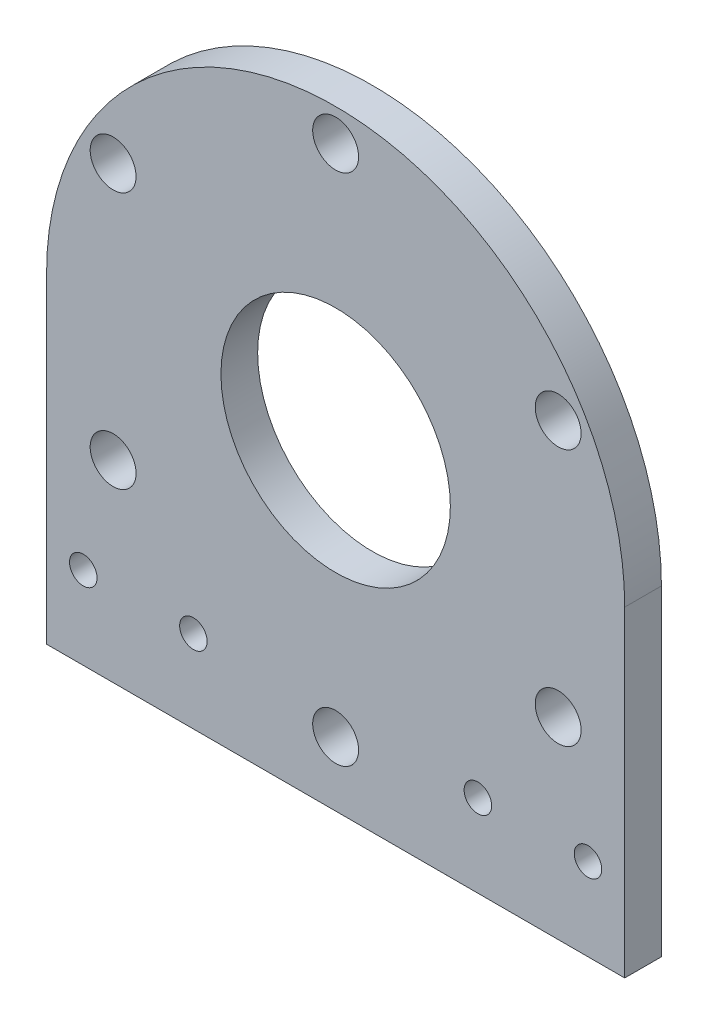
ISO-10303-21;
HEADER;
FILE_DESCRIPTION(('STEP AP214'),'2;1');
FILE_NAME('part.step','',(''),(''),'','','');
FILE_SCHEMA(('AUTOMOTIVE_DESIGN { 1 0 10303 214 1 1 1 1 }'));
ENDSEC;
DATA;
#1=APPLICATION_CONTEXT('core data for automotive mechanical design processes');
#2=APPLICATION_PROTOCOL_DEFINITION('international standard','automotive_design',2000,#1);
#3=PRODUCT_CONTEXT('',#1,'mechanical');
#4=PRODUCT('Part','Part','',(#3));
#5=PRODUCT_RELATED_PRODUCT_CATEGORY('part','',(#4));
#6=PRODUCT_DEFINITION_FORMATION('','',#4);
#7=PRODUCT_DEFINITION_CONTEXT('part definition',#1,'design');
#8=PRODUCT_DEFINITION('design','',#6,#7);
#9=PRODUCT_DEFINITION_SHAPE('','',#8);
#10=(LENGTH_UNIT() NAMED_UNIT(*) SI_UNIT(.MILLI.,.METRE.));
#11=(NAMED_UNIT(*) PLANE_ANGLE_UNIT() SI_UNIT($,.RADIAN.));
#12=(NAMED_UNIT(*) SI_UNIT($,.STERADIAN.) SOLID_ANGLE_UNIT());
#13=UNCERTAINTY_MEASURE_WITH_UNIT(LENGTH_MEASURE(1.E-05),#10,'distance_accuracy_value','');
#14=(GEOMETRIC_REPRESENTATION_CONTEXT(3) GLOBAL_UNCERTAINTY_ASSIGNED_CONTEXT((#13)) GLOBAL_UNIT_ASSIGNED_CONTEXT((#10,
#11,#12)) REPRESENTATION_CONTEXT('',''));
#15=CARTESIAN_POINT('',(0.,0.,0.));
#16=DIRECTION('',(0.,0.,1.));
#17=DIRECTION('',(1.,0.,0.));
#18=AXIS2_PLACEMENT_3D('',#15,#16,#17);
#19=CARTESIAN_POINT('',(0.,0.,4.));
#20=DIRECTION('',(0.,0.,-1.));
#21=DIRECTION('',(-1.,0.,0.));
#22=AXIS2_PLACEMENT_3D('',#19,#20,#21);
#23=CYLINDRICAL_SURFACE('',#22,31.5);
#24=CARTESIAN_POINT('',(0.,0.,0.));
#25=DIRECTION('',(0.,0.,1.));
#26=DIRECTION('',(1.,0.,0.));
#27=AXIS2_PLACEMENT_3D('',#24,#25,#26);
#28=CIRCLE('',#27,31.5);
#29=CARTESIAN_POINT('',(31.5,0.,0.));
#30=VERTEX_POINT('',#29);
#31=CARTESIAN_POINT('',(-31.5,0.,0.));
#32=VERTEX_POINT('',#31);
#33=EDGE_CURVE('E109',#30,#32,#28,.T.);
#34=ORIENTED_EDGE('',*,*,#33,.T.);
#35=DIRECTION('',(0.,0.,-1.));
#36=VECTOR('',#35,1.);
#37=CARTESIAN_POINT('',(-31.5,0.,4.));
#38=LINE('',#37,#36);
#39=CARTESIAN_POINT('',(-31.5,0.,4.));
#40=VERTEX_POINT('',#39);
#41=EDGE_CURVE('E11',#40,#32,#38,.T.);
#42=ORIENTED_EDGE('',*,*,#41,.F.);
#43=CARTESIAN_POINT('',(0.,0.,4.));
#44=DIRECTION('',(0.,0.,1.));
#45=DIRECTION('',(1.,0.,0.));
#46=AXIS2_PLACEMENT_3D('',#43,#44,#45);
#47=CIRCLE('',#46,31.5);
#48=CARTESIAN_POINT('',(31.5,0.,4.));
#49=VERTEX_POINT('',#48);
#50=EDGE_CURVE('E93',#49,#40,#47,.T.);
#51=ORIENTED_EDGE('',*,*,#50,.F.);
#52=DIRECTION('',(0.,0.,-1.));
#53=VECTOR('',#52,1.);
#54=CARTESIAN_POINT('',(31.5,0.,4.));
#55=LINE('',#54,#53);
#56=EDGE_CURVE('E105',#49,#30,#55,.T.);
#57=ORIENTED_EDGE('',*,*,#56,.T.);
#58=EDGE_LOOP('',(#34,#42,#51,#57));
#59=FACE_BOUND('',#58,.T.);
#60=ADVANCED_FACE('F41',(#59),#23,.T.);
#61=CARTESIAN_POINT('',(-31.5,0.,4.));
#62=DIRECTION('',(1.,0.,0.));
#63=DIRECTION('',(0.,1.,0.));
#64=AXIS2_PLACEMENT_3D('',#61,#62,#63);
#65=PLANE('',#64);
#66=DIRECTION('',(0.,-1.,0.));
#67=VECTOR('',#66,1.);
#68=CARTESIAN_POINT('',(-31.5,0.,0.));
#69=LINE('',#68,#67);
#70=CARTESIAN_POINT('',(-31.5,-35.,0.));
#71=VERTEX_POINT('',#70);
#72=EDGE_CURVE('E98',#32,#71,#69,.T.);
#73=ORIENTED_EDGE('',*,*,#72,.T.);
#74=DIRECTION('',(0.,0.,-1.));
#75=VECTOR('',#74,1.);
#76=CARTESIAN_POINT('',(-31.5,-35.,4.));
#77=LINE('',#76,#75);
#78=CARTESIAN_POINT('',(-31.5,-35.,4.));
#79=VERTEX_POINT('',#78);
#80=EDGE_CURVE('E50',#79,#71,#77,.T.);
#81=ORIENTED_EDGE('',*,*,#80,.F.);
#82=DIRECTION('',(0.,-1.,0.));
#83=VECTOR('',#82,1.);
#84=CARTESIAN_POINT('',(-31.5,0.,4.));
#85=LINE('',#84,#83);
#86=EDGE_CURVE('E88',#40,#79,#85,.T.);
#87=ORIENTED_EDGE('',*,*,#86,.F.);
#88=ORIENTED_EDGE('',*,*,#41,.T.);
#89=EDGE_LOOP('',(#73,#81,#87,#88));
#90=FACE_BOUND('',#89,.T.);
#91=ADVANCED_FACE('F97',(#90),#65,.F.);
#92=CARTESIAN_POINT('',(0.,-35.,4.));
#93=DIRECTION('',(0.,1.,0.));
#94=DIRECTION('',(0.,0.,1.));
#95=AXIS2_PLACEMENT_3D('',#92,#93,#94);
#96=PLANE('',#95);
#97=DIRECTION('',(1.,0.,0.));
#98=VECTOR('',#97,1.);
#99=CARTESIAN_POINT('',(0.,-35.,0.));
#100=LINE('',#99,#98);
#101=CARTESIAN_POINT('',(31.5,-35.,0.));
#102=VERTEX_POINT('',#101);
#103=EDGE_CURVE('E75',#71,#102,#100,.T.);
#104=ORIENTED_EDGE('',*,*,#103,.T.);
#105=DIRECTION('',(0.,0.,-1.));
#106=VECTOR('',#105,1.);
#107=CARTESIAN_POINT('',(31.5,-35.,4.));
#108=LINE('',#107,#106);
#109=CARTESIAN_POINT('',(31.5,-35.,4.));
#110=VERTEX_POINT('',#109);
#111=EDGE_CURVE('E100',#110,#102,#108,.T.);
#112=ORIENTED_EDGE('',*,*,#111,.F.);
#113=DIRECTION('',(1.,0.,0.));
#114=VECTOR('',#113,1.);
#115=CARTESIAN_POINT('',(0.,-35.,4.));
#116=LINE('',#115,#114);
#117=EDGE_CURVE('E91',#79,#110,#116,.T.);
#118=ORIENTED_EDGE('',*,*,#117,.F.);
#119=ORIENTED_EDGE('',*,*,#80,.T.);
#120=EDGE_LOOP('',(#104,#112,#118,#119));
#121=FACE_BOUND('',#120,.T.);
#122=ADVANCED_FACE('F101',(#121),#96,.F.);
#123=CARTESIAN_POINT('',(31.5,0.,4.));
#124=DIRECTION('',(-1.,0.,0.));
#125=DIRECTION('',(0.,-1.,0.));
#126=AXIS2_PLACEMENT_3D('',#123,#124,#125);
#127=PLANE('',#126);
#128=DIRECTION('',(0.,1.,0.));
#129=VECTOR('',#128,1.);
#130=CARTESIAN_POINT('',(31.5,0.,0.));
#131=LINE('',#130,#129);
#132=EDGE_CURVE('E81',#102,#30,#131,.T.);
#133=ORIENTED_EDGE('',*,*,#132,.T.);
#134=ORIENTED_EDGE('',*,*,#56,.F.);
#135=DIRECTION('',(0.,1.,0.));
#136=VECTOR('',#135,1.);
#137=CARTESIAN_POINT('',(31.5,0.,4.));
#138=LINE('',#137,#136);
#139=EDGE_CURVE('E58',#110,#49,#138,.T.);
#140=ORIENTED_EDGE('',*,*,#139,.F.);
#141=ORIENTED_EDGE('',*,*,#111,.T.);
#142=EDGE_LOOP('',(#133,#134,#140,#141));
#143=FACE_BOUND('',#142,.T.);
#144=ADVANCED_FACE('F123',(#143),#127,.F.);
#145=CARTESIAN_POINT('',(0.,0.,4.));
#146=DIRECTION('',(0.,0.,1.));
#147=DIRECTION('',(1.,0.,0.));
#148=AXIS2_PLACEMENT_3D('',#145,#146,#147);
#149=PLANE('',#148);
#150=CARTESIAN_POINT('',(-27.5,-26.,4.));
#151=DIRECTION('',(0.,0.,1.));
#152=DIRECTION('',(1.,0.,0.));
#153=AXIS2_PLACEMENT_3D('',#150,#151,#152);
#154=CIRCLE('',#153,1.5);
#155=CARTESIAN_POINT('',(-26.,-26.,4.));
#156=VERTEX_POINT('',#155);
#157=EDGE_CURVE('E210',#156,#156,#154,.T.);
#158=ORIENTED_EDGE('',*,*,#157,.F.);
#159=EDGE_LOOP('',(#158));
#160=FACE_BOUND('',#159,.T.);
#161=CARTESIAN_POINT('',(-15.5,-26.,4.));
#162=DIRECTION('',(0.,0.,1.));
#163=DIRECTION('',(1.,0.,0.));
#164=AXIS2_PLACEMENT_3D('',#161,#162,#163);
#165=CIRCLE('',#164,1.5);
#166=CARTESIAN_POINT('',(-14.,-26.,4.));
#167=VERTEX_POINT('',#166);
#168=EDGE_CURVE('E202',#167,#167,#165,.T.);
#169=ORIENTED_EDGE('',*,*,#168,.F.);
#170=EDGE_LOOP('',(#169));
#171=FACE_BOUND('',#170,.T.);
#172=CARTESIAN_POINT('',(15.5,-26.,4.));
#173=DIRECTION('',(0.,0.,1.));
#174=DIRECTION('',(-1.,0.,0.));
#175=AXIS2_PLACEMENT_3D('',#172,#173,#174);
#176=CIRCLE('',#175,1.5);
#177=CARTESIAN_POINT('',(14.,-26.,4.));
#178=VERTEX_POINT('',#177);
#179=EDGE_CURVE('E194',#178,#178,#176,.T.);
#180=ORIENTED_EDGE('',*,*,#179,.F.);
#181=EDGE_LOOP('',(#180));
#182=FACE_BOUND('',#181,.T.);
#183=CARTESIAN_POINT('',(27.5,-26.,4.));
#184=DIRECTION('',(0.,0.,1.));
#185=DIRECTION('',(-1.,0.,0.));
#186=AXIS2_PLACEMENT_3D('',#183,#184,#185);
#187=CIRCLE('',#186,1.5);
#188=CARTESIAN_POINT('',(26.,-26.,4.));
#189=VERTEX_POINT('',#188);
#190=EDGE_CURVE('E186',#189,#189,#187,.T.);
#191=ORIENTED_EDGE('',*,*,#190,.F.);
#192=EDGE_LOOP('',(#191));
#193=FACE_BOUND('',#192,.T.);
#194=CARTESIAN_POINT('',(-24.2487113059643,-14.,4.));
#195=DIRECTION('',(0.,0.,1.));
#196=DIRECTION('',(1.,0.,0.));
#197=AXIS2_PLACEMENT_3D('',#194,#195,#196);
#198=CIRCLE('',#197,2.5);
#199=CARTESIAN_POINT('',(-21.7487113059643,-14.,4.));
#200=VERTEX_POINT('',#199);
#201=EDGE_CURVE('E154',#200,#200,#198,.T.);
#202=ORIENTED_EDGE('',*,*,#201,.F.);
#203=EDGE_LOOP('',(#202));
#204=FACE_BOUND('',#203,.T.);
#205=CARTESIAN_POINT('',(24.2487113059643,-14.,4.));
#206=DIRECTION('',(0.,0.,1.));
#207=DIRECTION('',(1.,0.,0.));
#208=AXIS2_PLACEMENT_3D('',#205,#206,#207);
#209=CIRCLE('',#208,2.5);
#210=CARTESIAN_POINT('',(26.7487113059643,-14.,4.));
#211=VERTEX_POINT('',#210);
#212=EDGE_CURVE('E163',#211,#211,#209,.T.);
#213=ORIENTED_EDGE('',*,*,#212,.F.);
#214=EDGE_LOOP('',(#213));
#215=FACE_BOUND('',#214,.T.);
#216=CARTESIAN_POINT('',(0.,-28.,4.));
#217=DIRECTION('',(0.,0.,1.));
#218=DIRECTION('',(1.,0.,0.));
#219=AXIS2_PLACEMENT_3D('',#216,#217,#218);
#220=CIRCLE('',#219,2.5);
#221=CARTESIAN_POINT('',(2.5,-28.,4.));
#222=VERTEX_POINT('',#221);
#223=EDGE_CURVE('E138',#222,#222,#220,.T.);
#224=ORIENTED_EDGE('',*,*,#223,.F.);
#225=EDGE_LOOP('',(#224));
#226=FACE_BOUND('',#225,.T.);
#227=CARTESIAN_POINT('',(0.,28.,4.));
#228=DIRECTION('',(0.,0.,1.));
#229=DIRECTION('',(1.,0.,0.));
#230=AXIS2_PLACEMENT_3D('',#227,#228,#229);
#231=CIRCLE('',#230,2.5);
#232=CARTESIAN_POINT('',(2.5,28.,4.));
#233=VERTEX_POINT('',#232);
#234=EDGE_CURVE('E147',#233,#233,#231,.T.);
#235=ORIENTED_EDGE('',*,*,#234,.F.);
#236=EDGE_LOOP('',(#235));
#237=FACE_BOUND('',#236,.T.);
#238=CARTESIAN_POINT('',(-24.2487113059643,14.,4.));
#239=DIRECTION('',(0.,0.,1.));
#240=DIRECTION('',(1.,0.,0.));
#241=AXIS2_PLACEMENT_3D('',#238,#239,#240);
#242=CIRCLE('',#241,2.5);
#243=CARTESIAN_POINT('',(-21.7487113059643,14.,4.));
#244=VERTEX_POINT('',#243);
#245=EDGE_CURVE('E179',#244,#244,#242,.T.);
#246=ORIENTED_EDGE('',*,*,#245,.F.);
#247=EDGE_LOOP('',(#246));
#248=FACE_BOUND('',#247,.T.);
#249=CARTESIAN_POINT('',(24.2487113059643,14.,4.));
#250=DIRECTION('',(0.,0.,1.));
#251=DIRECTION('',(1.,0.,0.));
#252=AXIS2_PLACEMENT_3D('',#249,#250,#251);
#253=CIRCLE('',#252,2.5);
#254=CARTESIAN_POINT('',(26.7487113059643,14.,4.));
#255=VERTEX_POINT('',#254);
#256=EDGE_CURVE('E170',#255,#255,#253,.T.);
#257=ORIENTED_EDGE('',*,*,#256,.F.);
#258=EDGE_LOOP('',(#257));
#259=FACE_BOUND('',#258,.T.);
#260=CARTESIAN_POINT('',(0.,0.,4.));
#261=DIRECTION('',(0.,0.,1.));
#262=DIRECTION('',(1.,0.,0.));
#263=AXIS2_PLACEMENT_3D('',#260,#261,#262);
#264=CIRCLE('',#263,12.5);
#265=CARTESIAN_POINT('',(12.5,0.,4.));
#266=VERTEX_POINT('',#265);
#267=EDGE_CURVE('E130',#266,#266,#264,.T.);
#268=ORIENTED_EDGE('',*,*,#267,.F.);
#269=EDGE_LOOP('',(#268));
#270=FACE_BOUND('',#269,.T.);
#271=ORIENTED_EDGE('',*,*,#50,.T.);
#272=ORIENTED_EDGE('',*,*,#86,.T.);
#273=ORIENTED_EDGE('',*,*,#117,.T.);
#274=ORIENTED_EDGE('',*,*,#139,.T.);
#275=EDGE_LOOP('',(#271,#272,#273,#274));
#276=FACE_BOUND('',#275,.T.);
#277=ADVANCED_FACE('F89',(#160,#171,#182,#193,#204,#215,#226,#237,#248,#259,#270,#276),#149,.T.);
#278=CARTESIAN_POINT('',(0.,0.,0.));
#279=DIRECTION('',(0.,0.,1.));
#280=DIRECTION('',(1.,0.,0.));
#281=AXIS2_PLACEMENT_3D('',#278,#279,#280);
#282=PLANE('',#281);
#283=CARTESIAN_POINT('',(-27.5,-26.,0.));
#284=DIRECTION('',(0.,0.,1.));
#285=DIRECTION('',(1.,0.,0.));
#286=AXIS2_PLACEMENT_3D('',#283,#284,#285);
#287=CIRCLE('',#286,1.5);
#288=CARTESIAN_POINT('',(-26.,-26.,0.));
#289=VERTEX_POINT('',#288);
#290=EDGE_CURVE('E175',#289,#289,#287,.T.);
#291=ORIENTED_EDGE('',*,*,#290,.T.);
#292=EDGE_LOOP('',(#291));
#293=FACE_BOUND('',#292,.T.);
#294=CARTESIAN_POINT('',(-15.5,-26.,0.));
#295=DIRECTION('',(0.,0.,1.));
#296=DIRECTION('',(1.,0.,0.));
#297=AXIS2_PLACEMENT_3D('',#294,#295,#296);
#298=CIRCLE('',#297,1.5);
#299=CARTESIAN_POINT('',(-14.,-26.,0.));
#300=VERTEX_POINT('',#299);
#301=EDGE_CURVE('E206',#300,#300,#298,.T.);
#302=ORIENTED_EDGE('',*,*,#301,.T.);
#303=EDGE_LOOP('',(#302));
#304=FACE_BOUND('',#303,.T.);
#305=CARTESIAN_POINT('',(15.5,-26.,0.));
#306=DIRECTION('',(0.,0.,1.));
#307=DIRECTION('',(-1.,0.,0.));
#308=AXIS2_PLACEMENT_3D('',#305,#306,#307);
#309=CIRCLE('',#308,1.5);
#310=CARTESIAN_POINT('',(14.,-26.,0.));
#311=VERTEX_POINT('',#310);
#312=EDGE_CURVE('E198',#311,#311,#309,.T.);
#313=ORIENTED_EDGE('',*,*,#312,.T.);
#314=EDGE_LOOP('',(#313));
#315=FACE_BOUND('',#314,.T.);
#316=CARTESIAN_POINT('',(27.5,-26.,0.));
#317=DIRECTION('',(0.,0.,1.));
#318=DIRECTION('',(-1.,0.,0.));
#319=AXIS2_PLACEMENT_3D('',#316,#317,#318);
#320=CIRCLE('',#319,1.5);
#321=CARTESIAN_POINT('',(26.,-26.,0.));
#322=VERTEX_POINT('',#321);
#323=EDGE_CURVE('E190',#322,#322,#320,.T.);
#324=ORIENTED_EDGE('',*,*,#323,.T.);
#325=EDGE_LOOP('',(#324));
#326=FACE_BOUND('',#325,.T.);
#327=CARTESIAN_POINT('',(-24.2487113059643,-14.,0.));
#328=DIRECTION('',(0.,0.,1.));
#329=DIRECTION('',(1.,0.,0.));
#330=AXIS2_PLACEMENT_3D('',#327,#328,#329);
#331=CIRCLE('',#330,2.5);
#332=CARTESIAN_POINT('',(-21.7487113059643,-14.,0.));
#333=VERTEX_POINT('',#332);
#334=EDGE_CURVE('E158',#333,#333,#331,.T.);
#335=ORIENTED_EDGE('',*,*,#334,.T.);
#336=EDGE_LOOP('',(#335));
#337=FACE_BOUND('',#336,.T.);
#338=CARTESIAN_POINT('',(24.2487113059643,-14.,0.));
#339=DIRECTION('',(0.,0.,1.));
#340=DIRECTION('',(1.,0.,0.));
#341=AXIS2_PLACEMENT_3D('',#338,#339,#340);
#342=CIRCLE('',#341,2.5);
#343=CARTESIAN_POINT('',(26.7487113059643,-14.,0.));
#344=VERTEX_POINT('',#343);
#345=EDGE_CURVE('E143',#344,#344,#342,.T.);
#346=ORIENTED_EDGE('',*,*,#345,.T.);
#347=EDGE_LOOP('',(#346));
#348=FACE_BOUND('',#347,.T.);
#349=CARTESIAN_POINT('',(0.,-28.,0.));
#350=DIRECTION('',(0.,0.,1.));
#351=DIRECTION('',(1.,0.,0.));
#352=AXIS2_PLACEMENT_3D('',#349,#350,#351);
#353=CIRCLE('',#352,2.5);
#354=CARTESIAN_POINT('',(2.5,-28.,0.));
#355=VERTEX_POINT('',#354);
#356=EDGE_CURVE('E142',#355,#355,#353,.T.);
#357=ORIENTED_EDGE('',*,*,#356,.T.);
#358=EDGE_LOOP('',(#357));
#359=FACE_BOUND('',#358,.T.);
#360=CARTESIAN_POINT('',(0.,28.,0.));
#361=DIRECTION('',(0.,0.,1.));
#362=DIRECTION('',(1.,0.,0.));
#363=AXIS2_PLACEMENT_3D('',#360,#361,#362);
#364=CIRCLE('',#363,2.5);
#365=CARTESIAN_POINT('',(2.5,28.,0.));
#366=VERTEX_POINT('',#365);
#367=EDGE_CURVE('E134',#366,#366,#364,.T.);
#368=ORIENTED_EDGE('',*,*,#367,.T.);
#369=EDGE_LOOP('',(#368));
#370=FACE_BOUND('',#369,.T.);
#371=CARTESIAN_POINT('',(-24.2487113059643,14.,0.));
#372=DIRECTION('',(0.,0.,1.));
#373=DIRECTION('',(1.,0.,0.));
#374=AXIS2_PLACEMENT_3D('',#371,#372,#373);
#375=CIRCLE('',#374,2.5);
#376=CARTESIAN_POINT('',(-21.7487113059643,14.,0.));
#377=VERTEX_POINT('',#376);
#378=EDGE_CURVE('E159',#377,#377,#375,.T.);
#379=ORIENTED_EDGE('',*,*,#378,.T.);
#380=EDGE_LOOP('',(#379));
#381=FACE_BOUND('',#380,.T.);
#382=CARTESIAN_POINT('',(24.2487113059643,14.,0.));
#383=DIRECTION('',(0.,0.,1.));
#384=DIRECTION('',(1.,0.,0.));
#385=AXIS2_PLACEMENT_3D('',#382,#383,#384);
#386=CIRCLE('',#385,2.5);
#387=CARTESIAN_POINT('',(26.7487113059643,14.,0.));
#388=VERTEX_POINT('',#387);
#389=EDGE_CURVE('E174',#388,#388,#386,.T.);
#390=ORIENTED_EDGE('',*,*,#389,.T.);
#391=EDGE_LOOP('',(#390));
#392=FACE_BOUND('',#391,.T.);
#393=CARTESIAN_POINT('',(0.,0.,0.));
#394=DIRECTION('',(0.,0.,1.));
#395=DIRECTION('',(1.,0.,0.));
#396=AXIS2_PLACEMENT_3D('',#393,#394,#395);
#397=CIRCLE('',#396,12.5);
#398=CARTESIAN_POINT('',(12.5,0.,0.));
#399=VERTEX_POINT('',#398);
#400=EDGE_CURVE('E113',#399,#399,#397,.T.);
#401=ORIENTED_EDGE('',*,*,#400,.T.);
#402=EDGE_LOOP('',(#401));
#403=FACE_BOUND('',#402,.T.);
#404=ORIENTED_EDGE('',*,*,#33,.F.);
#405=ORIENTED_EDGE('',*,*,#132,.F.);
#406=ORIENTED_EDGE('',*,*,#103,.F.);
#407=ORIENTED_EDGE('',*,*,#72,.F.);
#408=EDGE_LOOP('',(#404,#405,#406,#407));
#409=FACE_BOUND('',#408,.T.);
#410=ADVANCED_FACE('F126',(#293,#304,#315,#326,#337,#348,#359,#370,#381,#392,#403,#409),#282,.F.);
#411=CARTESIAN_POINT('',(0.,0.,0.));
#412=DIRECTION('',(0.,0.,1.));
#413=DIRECTION('',(1.,0.,0.));
#414=AXIS2_PLACEMENT_3D('',#411,#412,#413);
#415=CYLINDRICAL_SURFACE('',#414,12.5);
#416=ORIENTED_EDGE('',*,*,#400,.F.);
#417=EDGE_LOOP('',(#416));
#418=FACE_BOUND('',#417,.T.);
#419=ORIENTED_EDGE('',*,*,#267,.T.);
#420=EDGE_LOOP('',(#419));
#421=FACE_BOUND('',#420,.T.);
#422=ADVANCED_FACE('F250',(#418,#421),#415,.F.);
#423=CARTESIAN_POINT('',(24.2487113059643,14.,0.));
#424=DIRECTION('',(0.,0.,1.));
#425=DIRECTION('',(1.,0.,0.));
#426=AXIS2_PLACEMENT_3D('',#423,#424,#425);
#427=CYLINDRICAL_SURFACE('',#426,2.5);
#428=ORIENTED_EDGE('',*,*,#389,.F.);
#429=EDGE_LOOP('',(#428));
#430=FACE_BOUND('',#429,.T.);
#431=ORIENTED_EDGE('',*,*,#256,.T.);
#432=EDGE_LOOP('',(#431));
#433=FACE_BOUND('',#432,.T.);
#434=ADVANCED_FACE('F252',(#430,#433),#427,.F.);
#435=CARTESIAN_POINT('',(-24.2487113059643,14.,0.));
#436=DIRECTION('',(0.,0.,1.));
#437=DIRECTION('',(1.,0.,0.));
#438=AXIS2_PLACEMENT_3D('',#435,#436,#437);
#439=CYLINDRICAL_SURFACE('',#438,2.5);
#440=ORIENTED_EDGE('',*,*,#378,.F.);
#441=EDGE_LOOP('',(#440));
#442=FACE_BOUND('',#441,.T.);
#443=ORIENTED_EDGE('',*,*,#245,.T.);
#444=EDGE_LOOP('',(#443));
#445=FACE_BOUND('',#444,.T.);
#446=ADVANCED_FACE('F259',(#442,#445),#439,.F.);
#447=CARTESIAN_POINT('',(0.,28.,0.));
#448=DIRECTION('',(0.,0.,1.));
#449=DIRECTION('',(1.,0.,0.));
#450=AXIS2_PLACEMENT_3D('',#447,#448,#449);
#451=CYLINDRICAL_SURFACE('',#450,2.5);
#452=ORIENTED_EDGE('',*,*,#367,.F.);
#453=EDGE_LOOP('',(#452));
#454=FACE_BOUND('',#453,.T.);
#455=ORIENTED_EDGE('',*,*,#234,.T.);
#456=EDGE_LOOP('',(#455));
#457=FACE_BOUND('',#456,.T.);
#458=ADVANCED_FACE('F336',(#454,#457),#451,.F.);
#459=CARTESIAN_POINT('',(0.,-28.,0.));
#460=DIRECTION('',(0.,0.,1.));
#461=DIRECTION('',(1.,0.,0.));
#462=AXIS2_PLACEMENT_3D('',#459,#460,#461);
#463=CYLINDRICAL_SURFACE('',#462,2.5);
#464=ORIENTED_EDGE('',*,*,#356,.F.);
#465=EDGE_LOOP('',(#464));
#466=FACE_BOUND('',#465,.T.);
#467=ORIENTED_EDGE('',*,*,#223,.T.);
#468=EDGE_LOOP('',(#467));
#469=FACE_BOUND('',#468,.T.);
#470=ADVANCED_FACE('F342',(#466,#469),#463,.F.);
#471=CARTESIAN_POINT('',(24.2487113059643,-14.,0.));
#472=DIRECTION('',(0.,0.,1.));
#473=DIRECTION('',(1.,0.,0.));
#474=AXIS2_PLACEMENT_3D('',#471,#472,#473);
#475=CYLINDRICAL_SURFACE('',#474,2.5);
#476=ORIENTED_EDGE('',*,*,#345,.F.);
#477=EDGE_LOOP('',(#476));
#478=FACE_BOUND('',#477,.T.);
#479=ORIENTED_EDGE('',*,*,#212,.T.);
#480=EDGE_LOOP('',(#479));
#481=FACE_BOUND('',#480,.T.);
#482=ADVANCED_FACE('F339',(#478,#481),#475,.F.);
#483=CARTESIAN_POINT('',(-24.2487113059643,-14.,0.));
#484=DIRECTION('',(0.,0.,1.));
#485=DIRECTION('',(1.,0.,0.));
#486=AXIS2_PLACEMENT_3D('',#483,#484,#485);
#487=CYLINDRICAL_SURFACE('',#486,2.5);
#488=ORIENTED_EDGE('',*,*,#334,.F.);
#489=EDGE_LOOP('',(#488));
#490=FACE_BOUND('',#489,.T.);
#491=ORIENTED_EDGE('',*,*,#201,.T.);
#492=EDGE_LOOP('',(#491));
#493=FACE_BOUND('',#492,.T.);
#494=ADVANCED_FACE('F301',(#490,#493),#487,.F.);
#495=CARTESIAN_POINT('',(27.5,-26.,0.));
#496=DIRECTION('',(0.,0.,1.));
#497=DIRECTION('',(1.,0.,0.));
#498=AXIS2_PLACEMENT_3D('',#495,#496,#497);
#499=CYLINDRICAL_SURFACE('',#498,1.5);
#500=ORIENTED_EDGE('',*,*,#323,.F.);
#501=EDGE_LOOP('',(#500));
#502=FACE_BOUND('',#501,.T.);
#503=ORIENTED_EDGE('',*,*,#190,.T.);
#504=EDGE_LOOP('',(#503));
#505=FACE_BOUND('',#504,.T.);
#506=ADVANCED_FACE('F295',(#502,#505),#499,.F.);
#507=CARTESIAN_POINT('',(15.5,-26.,0.));
#508=DIRECTION('',(0.,0.,1.));
#509=DIRECTION('',(1.,0.,0.));
#510=AXIS2_PLACEMENT_3D('',#507,#508,#509);
#511=CYLINDRICAL_SURFACE('',#510,1.5);
#512=ORIENTED_EDGE('',*,*,#312,.F.);
#513=EDGE_LOOP('',(#512));
#514=FACE_BOUND('',#513,.T.);
#515=ORIENTED_EDGE('',*,*,#179,.T.);
#516=EDGE_LOOP('',(#515));
#517=FACE_BOUND('',#516,.T.);
#518=ADVANCED_FACE('F300',(#514,#517),#511,.F.);
#519=CARTESIAN_POINT('',(-15.5,-26.,0.));
#520=DIRECTION('',(0.,0.,1.));
#521=DIRECTION('',(1.,0.,0.));
#522=AXIS2_PLACEMENT_3D('',#519,#520,#521);
#523=CYLINDRICAL_SURFACE('',#522,1.5);
#524=ORIENTED_EDGE('',*,*,#301,.F.);
#525=EDGE_LOOP('',(#524));
#526=FACE_BOUND('',#525,.T.);
#527=ORIENTED_EDGE('',*,*,#168,.T.);
#528=EDGE_LOOP('',(#527));
#529=FACE_BOUND('',#528,.T.);
#530=ADVANCED_FACE('F223',(#526,#529),#523,.F.);
#531=CARTESIAN_POINT('',(-27.5,-26.,0.));
#532=DIRECTION('',(0.,0.,1.));
#533=DIRECTION('',(1.,0.,0.));
#534=AXIS2_PLACEMENT_3D('',#531,#532,#533);
#535=CYLINDRICAL_SURFACE('',#534,1.5);
#536=ORIENTED_EDGE('',*,*,#290,.F.);
#537=EDGE_LOOP('',(#536));
#538=FACE_BOUND('',#537,.T.);
#539=ORIENTED_EDGE('',*,*,#157,.T.);
#540=EDGE_LOOP('',(#539));
#541=FACE_BOUND('',#540,.T.);
#542=ADVANCED_FACE('F220',(#538,#541),#535,.F.);
#543=CLOSED_SHELL('',(#60,#91,#122,#144,#277,#410,#422,#434,#446,#458,#470,#482,#494,#506,#518,
#530,#542));
#544=MANIFOLD_SOLID_BREP('B2',#543);
#545=ADVANCED_BREP_SHAPE_REPRESENTATION('',(#18,#544),#14);
#546=SHAPE_DEFINITION_REPRESENTATION(#9,#545);
ENDSEC;
END-ISO-10303-21;
